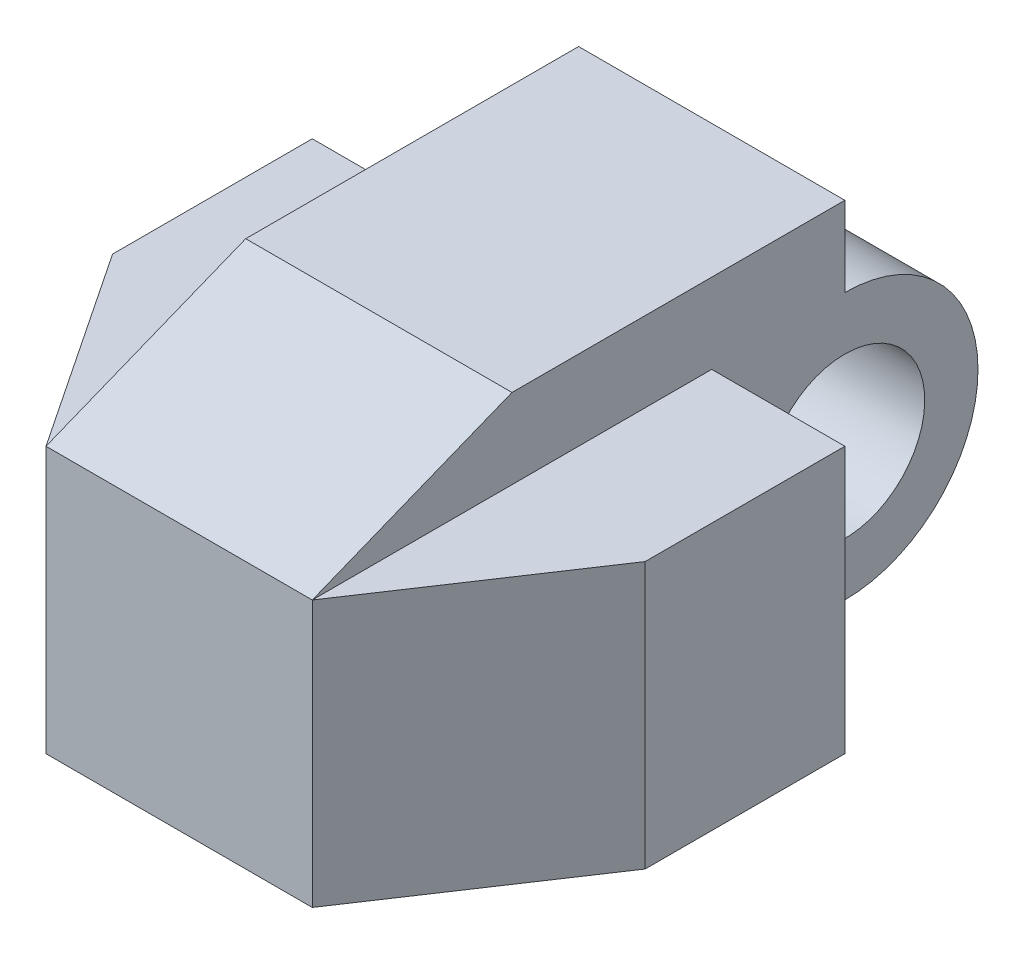
ISO-10303-21;
HEADER;
FILE_DESCRIPTION(('STEP AP214'),'2;1');
FILE_NAME('part.step','',(''),(''),'','','');
FILE_SCHEMA(('AUTOMOTIVE_DESIGN { 1 0 10303 214 1 1 1 1 }'));
ENDSEC;
DATA;
#1=APPLICATION_CONTEXT('core data for automotive mechanical design processes');
#2=APPLICATION_PROTOCOL_DEFINITION('international standard','automotive_design',2000,#1);
#3=PRODUCT_CONTEXT('',#1,'mechanical');
#4=PRODUCT('Part','Part','',(#3));
#5=PRODUCT_RELATED_PRODUCT_CATEGORY('part','',(#4));
#6=PRODUCT_DEFINITION_FORMATION('','',#4);
#7=PRODUCT_DEFINITION_CONTEXT('part definition',#1,'design');
#8=PRODUCT_DEFINITION('design','',#6,#7);
#9=PRODUCT_DEFINITION_SHAPE('','',#8);
#10=(LENGTH_UNIT() NAMED_UNIT(*) SI_UNIT(.MILLI.,.METRE.));
#11=(NAMED_UNIT(*) PLANE_ANGLE_UNIT() SI_UNIT($,.RADIAN.));
#12=(NAMED_UNIT(*) SI_UNIT($,.STERADIAN.) SOLID_ANGLE_UNIT());
#13=UNCERTAINTY_MEASURE_WITH_UNIT(LENGTH_MEASURE(1.E-05),#10,'distance_accuracy_value','');
#14=(GEOMETRIC_REPRESENTATION_CONTEXT(3) GLOBAL_UNCERTAINTY_ASSIGNED_CONTEXT((#13)) GLOBAL_UNIT_ASSIGNED_CONTEXT((#10,
#11,#12)) REPRESENTATION_CONTEXT('',''));
#15=CARTESIAN_POINT('',(0.,0.,0.));
#16=DIRECTION('',(0.,0.,1.));
#17=DIRECTION('',(1.,0.,0.));
#18=AXIS2_PLACEMENT_3D('',#15,#16,#17);
#19=CARTESIAN_POINT('',(-3.67875647668393,4.89637305699482,10.));
#20=DIRECTION('',(0.,-1.,0.));
#21=DIRECTION('',(0.,0.,-1.));
#22=AXIS2_PLACEMENT_3D('',#19,#20,#21);
#23=PLANE('',#22);
#24=DIRECTION('',(0.,0.,1.));
#25=VECTOR('',#24,1.);
#26=CARTESIAN_POINT('',(-3.67875647668393,4.89637305699482,5.));
#27=LINE('',#26,#25);
#28=CARTESIAN_POINT('',(-3.67875647668393,4.89637305699482,10.));
#29=VERTEX_POINT('',#28);
#30=CARTESIAN_POINT('',(-3.67875647668393,4.89637305699482,25.));
#31=VERTEX_POINT('',#30);
#32=EDGE_CURVE('E137',#29,#31,#27,.T.);
#33=ORIENTED_EDGE('',*,*,#32,.F.);
#34=DIRECTION('',(-1.,0.,0.));
#35=VECTOR('',#34,1.);
#36=CARTESIAN_POINT('',(-8.67875647668393,4.89637305699482,10.));
#37=LINE('',#36,#35);
#38=CARTESIAN_POINT('',(-8.67875647668393,4.89637305699482,10.));
#39=VERTEX_POINT('',#38);
#40=EDGE_CURVE('E216',#29,#39,#37,.T.);
#41=ORIENTED_EDGE('',*,*,#40,.T.);
#42=DIRECTION('',(0.,0.,-1.));
#43=VECTOR('',#42,1.);
#44=CARTESIAN_POINT('',(-8.67875647668393,4.89637305699482,25.));
#45=LINE('',#44,#43);
#46=CARTESIAN_POINT('',(-8.67875647668393,4.89637305699482,17.5));
#47=VERTEX_POINT('',#46);
#48=EDGE_CURVE('E213',#47,#39,#45,.T.);
#49=ORIENTED_EDGE('',*,*,#48,.F.);
#50=DIRECTION('',(-0.554700196225229,0.,-0.832050294337844));
#51=VECTOR('',#50,1.);
#52=CARTESIAN_POINT('',(-14.0852929453966,4.89637305699482,9.39019529693105));
#53=LINE('',#52,#51);
#54=EDGE_CURVE('E232',#31,#47,#53,.T.);
#55=ORIENTED_EDGE('',*,*,#54,.F.);
#56=EDGE_LOOP('',(#33,#41,#49,#55));
#57=FACE_BOUND('',#56,.T.);
#58=ADVANCED_FACE('F38',(#57),#23,.F.);
#59=DIRECTION('',(0.,0.,-1.));
#60=VECTOR('',#59,1.);
#61=CARTESIAN_POINT('',(6.32124352331607,4.89637305699482,5.));
#62=LINE('',#61,#60);
#63=CARTESIAN_POINT('',(6.32124352331607,4.89637305699482,25.));
#64=VERTEX_POINT('',#63);
#65=CARTESIAN_POINT('',(6.32124352331607,4.89637305699482,10.));
#66=VERTEX_POINT('',#65);
#67=EDGE_CURVE('E146',#64,#66,#62,.T.);
#68=ORIENTED_EDGE('',*,*,#67,.F.);
#69=DIRECTION('',(0.554700196225229,0.,-0.832050294337844));
#70=VECTOR('',#69,1.);
#71=CARTESIAN_POINT('',(15.9147070546034,4.89637305699482,10.609804703069));
#72=LINE('',#71,#70);
#73=CARTESIAN_POINT('',(11.3212435233161,4.89637305699482,17.5));
#74=VERTEX_POINT('',#73);
#75=EDGE_CURVE('E155',#64,#74,#72,.T.);
#76=ORIENTED_EDGE('',*,*,#75,.T.);
#77=DIRECTION('',(0.,0.,-1.));
#78=VECTOR('',#77,1.);
#79=CARTESIAN_POINT('',(11.3212435233161,4.89637305699482,25.));
#80=LINE('',#79,#78);
#81=CARTESIAN_POINT('',(11.3212435233161,4.89637305699482,10.));
#82=VERTEX_POINT('',#81);
#83=EDGE_CURVE('E211',#74,#82,#80,.T.);
#84=ORIENTED_EDGE('',*,*,#83,.T.);
#85=EDGE_CURVE('E158',#82,#66,#37,.T.);
#86=ORIENTED_EDGE('',*,*,#85,.T.);
#87=EDGE_LOOP('',(#68,#76,#84,#86));
#88=FACE_BOUND('',#87,.T.);
#89=ADVANCED_FACE('F154',(#88),#23,.F.);
#90=CARTESIAN_POINT('',(-3.67875647668393,-5.10362694300518,10.));
#91=DIRECTION('',(0.,1.,0.));
#92=DIRECTION('',(0.,0.,1.));
#93=AXIS2_PLACEMENT_3D('',#90,#91,#92);
#94=PLANE('',#93);
#95=DIRECTION('',(1.,0.,0.));
#96=VECTOR('',#95,1.);
#97=CARTESIAN_POINT('',(-8.67875647668393,-5.10362694300518,25.));
#98=LINE('',#97,#96);
#99=CARTESIAN_POINT('',(-3.67875647668393,-5.10362694300518,25.));
#100=VERTEX_POINT('',#99);
#101=CARTESIAN_POINT('',(6.32124352331607,-5.10362694300518,25.));
#102=VERTEX_POINT('',#101);
#103=EDGE_CURVE('E171',#100,#102,#98,.T.);
#104=ORIENTED_EDGE('',*,*,#103,.F.);
#105=DIRECTION('',(-0.554700196225229,0.,-0.832050294337844));
#106=VECTOR('',#105,1.);
#107=CARTESIAN_POINT('',(-10.6018333997609,-5.10362694300518,14.6153846153846));
#108=LINE('',#107,#106);
#109=CARTESIAN_POINT('',(-8.67875647668393,-5.10362694300518,17.5));
#110=VERTEX_POINT('',#109);
#111=EDGE_CURVE('E60',#100,#110,#108,.T.);
#112=ORIENTED_EDGE('',*,*,#111,.T.);
#113=DIRECTION('',(0.,0.,-1.));
#114=VECTOR('',#113,1.);
#115=CARTESIAN_POINT('',(-8.67875647668393,-5.10362694300518,25.));
#116=LINE('',#115,#114);
#117=CARTESIAN_POINT('',(-8.67875647668393,-5.10362694300518,10.));
#118=VERTEX_POINT('',#117);
#119=EDGE_CURVE('E180',#110,#118,#116,.T.);
#120=ORIENTED_EDGE('',*,*,#119,.T.);
#121=DIRECTION('',(1.,0.,0.));
#122=VECTOR('',#121,1.);
#123=CARTESIAN_POINT('',(-8.67875647668393,-5.10362694300518,10.));
#124=LINE('',#123,#122);
#125=CARTESIAN_POINT('',(-3.67875647668393,-5.10362694300518,10.));
#126=VERTEX_POINT('',#125);
#127=EDGE_CURVE('E220',#118,#126,#124,.T.);
#128=ORIENTED_EDGE('',*,*,#127,.T.);
#129=DIRECTION('',(0.,0.,-1.));
#130=VECTOR('',#129,1.);
#131=CARTESIAN_POINT('',(-3.67875647668393,-5.10362694300518,10.));
#132=LINE('',#131,#130);
#133=CARTESIAN_POINT('',(-3.67875647668393,-5.10362694300518,5.));
#134=VERTEX_POINT('',#133);
#135=EDGE_CURVE('E192',#126,#134,#132,.T.);
#136=ORIENTED_EDGE('',*,*,#135,.T.);
#137=DIRECTION('',(1.,0.,0.));
#138=VECTOR('',#137,1.);
#139=CARTESIAN_POINT('',(-3.67875647668393,-5.10362694300518,5.));
#140=LINE('',#139,#138);
#141=CARTESIAN_POINT('',(6.32124352331607,-5.10362694300518,5.));
#142=VERTEX_POINT('',#141);
#143=EDGE_CURVE('E189',#134,#142,#140,.T.);
#144=ORIENTED_EDGE('',*,*,#143,.T.);
#145=DIRECTION('',(0.,0.,-1.));
#146=VECTOR('',#145,1.);
#147=CARTESIAN_POINT('',(6.32124352331607,-5.10362694300518,10.));
#148=LINE('',#147,#146);
#149=CARTESIAN_POINT('',(6.32124352331607,-5.10362694300518,10.));
#150=VERTEX_POINT('',#149);
#151=EDGE_CURVE('E195',#150,#142,#148,.T.);
#152=ORIENTED_EDGE('',*,*,#151,.F.);
#153=CARTESIAN_POINT('',(11.3212435233161,-5.10362694300518,10.));
#154=VERTEX_POINT('',#153);
#155=EDGE_CURVE('E223',#150,#154,#124,.T.);
#156=ORIENTED_EDGE('',*,*,#155,.T.);
#157=DIRECTION('',(0.,0.,-1.));
#158=VECTOR('',#157,1.);
#159=CARTESIAN_POINT('',(11.3212435233161,-5.10362694300518,25.));
#160=LINE('',#159,#158);
#161=CARTESIAN_POINT('',(11.3212435233161,-5.10362694300518,17.5));
#162=VERTEX_POINT('',#161);
#163=EDGE_CURVE('E209',#162,#154,#160,.T.);
#164=ORIENTED_EDGE('',*,*,#163,.F.);
#165=DIRECTION('',(0.554700196225229,0.,-0.832050294337844));
#166=VECTOR('',#165,1.);
#167=CARTESIAN_POINT('',(10.1673973694699,-5.10362694300518,19.2307692307692));
#168=LINE('',#167,#166);
#169=EDGE_CURVE('E229',#102,#162,#168,.T.);
#170=ORIENTED_EDGE('',*,*,#169,.F.);
#171=EDGE_LOOP('',(#104,#112,#120,#128,#136,#144,#152,#156,#164,#170));
#172=FACE_BOUND('',#171,.T.);
#173=ADVANCED_FACE('F269',(#172),#94,.F.);
#174=CARTESIAN_POINT('',(11.3212435233161,4.89637305699482,25.));
#175=DIRECTION('',(-1.,0.,0.));
#176=DIRECTION('',(0.,0.,1.));
#177=AXIS2_PLACEMENT_3D('',#174,#175,#176);
#178=PLANE('',#177);
#179=DIRECTION('',(0.,1.,0.));
#180=VECTOR('',#179,1.);
#181=CARTESIAN_POINT('',(11.3212435233161,-10.1036269430052,17.5));
#182=LINE('',#181,#180);
#183=EDGE_CURVE('E165',#162,#74,#182,.T.);
#184=ORIENTED_EDGE('',*,*,#183,.F.);
#185=ORIENTED_EDGE('',*,*,#163,.T.);
#186=DIRECTION('',(0.,1.,0.));
#187=VECTOR('',#186,1.);
#188=CARTESIAN_POINT('',(11.3212435233161,4.89637305699482,10.));
#189=LINE('',#188,#187);
#190=EDGE_CURVE('E217',#154,#82,#189,.T.);
#191=ORIENTED_EDGE('',*,*,#190,.T.);
#192=ORIENTED_EDGE('',*,*,#83,.F.);
#193=EDGE_LOOP('',(#184,#185,#191,#192));
#194=FACE_BOUND('',#193,.T.);
#195=ADVANCED_FACE('F277',(#194),#178,.F.);
#196=CARTESIAN_POINT('',(0.,0.,25.));
#197=DIRECTION('',(0.,0.,1.));
#198=DIRECTION('',(1.,0.,0.));
#199=AXIS2_PLACEMENT_3D('',#196,#197,#198);
#200=PLANE('',#199);
#201=DIRECTION('',(-1.,0.,0.));
#202=VECTOR('',#201,1.);
#203=CARTESIAN_POINT('',(6.32124352331607,4.89637305699482,25.));
#204=LINE('',#203,#202);
#205=EDGE_CURVE('E131',#64,#31,#204,.T.);
#206=ORIENTED_EDGE('',*,*,#205,.T.);
#207=DIRECTION('',(0.,1.,0.));
#208=VECTOR('',#207,1.);
#209=CARTESIAN_POINT('',(-3.67875647668393,0.,25.));
#210=LINE('',#209,#208);
#211=EDGE_CURVE('E11',#100,#31,#210,.T.);
#212=ORIENTED_EDGE('',*,*,#211,.F.);
#213=ORIENTED_EDGE('',*,*,#103,.T.);
#214=DIRECTION('',(0.,1.,0.));
#215=VECTOR('',#214,1.);
#216=CARTESIAN_POINT('',(6.32124352331608,0.,25.));
#217=LINE('',#216,#215);
#218=EDGE_CURVE('E46',#102,#64,#217,.T.);
#219=ORIENTED_EDGE('',*,*,#218,.T.);
#220=EDGE_LOOP('',(#206,#212,#213,#219));
#221=FACE_BOUND('',#220,.T.);
#222=ADVANCED_FACE('F169',(#221),#200,.T.);
#223=CARTESIAN_POINT('',(-3.67875647668393,4.89637305699482,10.));
#224=DIRECTION('',(1.,0.,0.));
#225=DIRECTION('',(0.,0.,-1.));
#226=AXIS2_PLACEMENT_3D('',#223,#224,#225);
#227=PLANE('',#226);
#228=CARTESIAN_POINT('',(-3.67875647668393,-0.103626943005185,5.));
#229=DIRECTION('',(1.,0.,0.));
#230=DIRECTION('',(0.,1.,0.));
#231=AXIS2_PLACEMENT_3D('',#228,#229,#230);
#232=CIRCLE('',#231,3.);
#233=CARTESIAN_POINT('',(-3.67875647668393,2.89637305699482,5.));
#234=VERTEX_POINT('',#233);
#235=EDGE_CURVE('E203',#234,#234,#232,.T.);
#236=ORIENTED_EDGE('',*,*,#235,.T.);
#237=EDGE_LOOP('',(#236));
#238=FACE_BOUND('',#237,.T.);
#239=ORIENTED_EDGE('',*,*,#32,.T.);
#240=DIRECTION('',(0.,-0.371390676354104,0.928476690885259));
#241=VECTOR('',#240,1.);
#242=CARTESIAN_POINT('',(-3.67875647668393,7.89637305699482,17.5));
#243=LINE('',#242,#241);
#244=CARTESIAN_POINT('',(-3.67875647668393,7.89637305699482,17.5));
#245=VERTEX_POINT('',#244);
#246=EDGE_CURVE('E134',#245,#31,#243,.T.);
#247=ORIENTED_EDGE('',*,*,#246,.F.);
#248=DIRECTION('',(0.,0.,1.));
#249=VECTOR('',#248,1.);
#250=CARTESIAN_POINT('',(-3.67875647668393,7.89637305699482,5.));
#251=LINE('',#250,#249);
#252=CARTESIAN_POINT('',(-3.67875647668393,7.89637305699482,5.));
#253=VERTEX_POINT('',#252);
#254=EDGE_CURVE('E159',#253,#245,#251,.T.);
#255=ORIENTED_EDGE('',*,*,#254,.F.);
#256=DIRECTION('',(0.,-1.,0.));
#257=VECTOR('',#256,1.);
#258=CARTESIAN_POINT('',(-3.67875647668393,7.89637305699482,5.));
#259=LINE('',#258,#257);
#260=CARTESIAN_POINT('',(-3.67875647668393,4.89637305699482,5.));
#261=VERTEX_POINT('',#260);
#262=EDGE_CURVE('E239',#253,#261,#259,.T.);
#263=ORIENTED_EDGE('',*,*,#262,.T.);
#264=CARTESIAN_POINT('',(-3.67875647668393,-0.103626943005183,5.));
#265=DIRECTION('',(1.,0.,0.));
#266=DIRECTION('',(0.,0.,-1.));
#267=AXIS2_PLACEMENT_3D('',#264,#265,#266);
#268=CIRCLE('',#267,5.);
#269=CARTESIAN_POINT('',(-3.67875647668393,-0.103626943005183,0.));
#270=VERTEX_POINT('',#269);
#271=EDGE_CURVE('E183',#261,#270,#268,.F.);
#272=ORIENTED_EDGE('',*,*,#271,.T.);
#273=CARTESIAN_POINT('',(-3.67875647668393,-0.103626943005183,5.));
#274=DIRECTION('',(1.,0.,0.));
#275=DIRECTION('',(0.,0.,-1.));
#276=AXIS2_PLACEMENT_3D('',#273,#274,#275);
#277=CIRCLE('',#276,5.);
#278=EDGE_CURVE('E174',#270,#134,#277,.F.);
#279=ORIENTED_EDGE('',*,*,#278,.T.);
#280=ORIENTED_EDGE('',*,*,#135,.F.);
#281=DIRECTION('',(0.,-1.,0.));
#282=VECTOR('',#281,1.);
#283=CARTESIAN_POINT('',(-3.67875647668393,4.89637305699482,10.));
#284=LINE('',#283,#282);
#285=EDGE_CURVE('E200',#29,#126,#284,.T.);
#286=ORIENTED_EDGE('',*,*,#285,.F.);
#287=EDGE_LOOP('',(#239,#247,#255,#263,#272,#279,#280,#286));
#288=FACE_BOUND('',#287,.T.);
#289=ADVANCED_FACE('F253',(#238,#288),#227,.F.);
#290=CARTESIAN_POINT('',(6.32124352331607,4.89637305699482,10.));
#291=DIRECTION('',(-1.,0.,0.));
#292=DIRECTION('',(0.,-1.,0.));
#293=AXIS2_PLACEMENT_3D('',#290,#291,#292);
#294=PLANE('',#293);
#295=CARTESIAN_POINT('',(6.32124352331607,-0.103626943005183,5.));
#296=DIRECTION('',(1.,0.,0.));
#297=DIRECTION('',(0.,1.,0.));
#298=AXIS2_PLACEMENT_3D('',#295,#296,#297);
#299=CIRCLE('',#298,3.);
#300=CARTESIAN_POINT('',(6.32124352331607,2.89637305699482,5.));
#301=VERTEX_POINT('',#300);
#302=EDGE_CURVE('E179',#301,#301,#299,.T.);
#303=ORIENTED_EDGE('',*,*,#302,.F.);
#304=EDGE_LOOP('',(#303));
#305=FACE_BOUND('',#304,.T.);
#306=DIRECTION('',(0.,0.,-1.));
#307=VECTOR('',#306,1.);
#308=CARTESIAN_POINT('',(6.32124352331607,7.89637305699482,5.));
#309=LINE('',#308,#307);
#310=CARTESIAN_POINT('',(6.32124352331607,7.89637305699482,17.5));
#311=VERTEX_POINT('',#310);
#312=CARTESIAN_POINT('',(6.32124352331607,7.89637305699482,5.));
#313=VERTEX_POINT('',#312);
#314=EDGE_CURVE('E148',#311,#313,#309,.T.);
#315=ORIENTED_EDGE('',*,*,#314,.F.);
#316=DIRECTION('',(0.,-0.371390676354104,0.928476690885259));
#317=VECTOR('',#316,1.);
#318=CARTESIAN_POINT('',(6.32124352331607,7.89637305699482,17.5));
#319=LINE('',#318,#317);
#320=EDGE_CURVE('E53',#311,#64,#319,.T.);
#321=ORIENTED_EDGE('',*,*,#320,.T.);
#322=ORIENTED_EDGE('',*,*,#67,.T.);
#323=DIRECTION('',(0.,1.,0.));
#324=VECTOR('',#323,1.);
#325=CARTESIAN_POINT('',(6.32124352331607,4.89637305699482,10.));
#326=LINE('',#325,#324);
#327=EDGE_CURVE('E198',#150,#66,#326,.T.);
#328=ORIENTED_EDGE('',*,*,#327,.F.);
#329=ORIENTED_EDGE('',*,*,#151,.T.);
#330=CARTESIAN_POINT('',(6.32124352331607,-0.103626943005183,5.));
#331=DIRECTION('',(-1.,0.,0.));
#332=DIRECTION('',(0.,-1.,0.));
#333=AXIS2_PLACEMENT_3D('',#330,#331,#332);
#334=CIRCLE('',#333,5.);
#335=CARTESIAN_POINT('',(6.32124352331607,-0.103626943005183,0.));
#336=VERTEX_POINT('',#335);
#337=EDGE_CURVE('E185',#142,#336,#334,.F.);
#338=ORIENTED_EDGE('',*,*,#337,.T.);
#339=CARTESIAN_POINT('',(6.32124352331607,-0.103626943005183,5.));
#340=DIRECTION('',(-1.,0.,0.));
#341=DIRECTION('',(0.,-1.,0.));
#342=AXIS2_PLACEMENT_3D('',#339,#340,#341);
#343=CIRCLE('',#342,5.);
#344=CARTESIAN_POINT('',(6.32124352331607,4.89637305699482,5.));
#345=VERTEX_POINT('',#344);
#346=EDGE_CURVE('E187',#336,#345,#343,.F.);
#347=ORIENTED_EDGE('',*,*,#346,.T.);
#348=DIRECTION('',(0.,-1.,0.));
#349=VECTOR('',#348,1.);
#350=CARTESIAN_POINT('',(6.32124352331607,7.89637305699482,5.));
#351=LINE('',#350,#349);
#352=EDGE_CURVE('E166',#313,#345,#351,.T.);
#353=ORIENTED_EDGE('',*,*,#352,.F.);
#354=EDGE_LOOP('',(#315,#321,#322,#328,#329,#338,#347,#353));
#355=FACE_BOUND('',#354,.T.);
#356=ADVANCED_FACE('F144',(#305,#355),#294,.F.);
#357=CARTESIAN_POINT('',(-3.67875647668393,-0.103626943005185,5.));
#358=DIRECTION('',(1.,0.,0.));
#359=DIRECTION('',(0.,1.,0.));
#360=AXIS2_PLACEMENT_3D('',#357,#358,#359);
#361=CYLINDRICAL_SURFACE('',#360,3.);
#362=ORIENTED_EDGE('',*,*,#235,.F.);
#363=EDGE_LOOP('',(#362));
#364=FACE_BOUND('',#363,.T.);
#365=ORIENTED_EDGE('',*,*,#302,.T.);
#366=EDGE_LOOP('',(#365));
#367=FACE_BOUND('',#366,.T.);
#368=ADVANCED_FACE('F296',(#364,#367),#361,.F.);
#369=CARTESIAN_POINT('',(-3.67875647668393,-0.103626943005183,5.));
#370=DIRECTION('',(-1.,0.,0.));
#371=DIRECTION('',(0.,0.,1.));
#372=AXIS2_PLACEMENT_3D('',#369,#370,#371);
#373=CYLINDRICAL_SURFACE('',#372,5.);
#374=DIRECTION('',(-1.,0.,0.));
#375=VECTOR('',#374,1.);
#376=CARTESIAN_POINT('',(0.,-0.103626943005183,0.));
#377=LINE('',#376,#375);
#378=EDGE_CURVE('E177',#270,#336,#377,.F.);
#379=ORIENTED_EDGE('',*,*,#378,.F.);
#380=ORIENTED_EDGE('',*,*,#271,.F.);
#381=DIRECTION('',(-1.,0.,0.));
#382=VECTOR('',#381,1.);
#383=CARTESIAN_POINT('',(-3.67875647668393,4.89637305699482,5.));
#384=LINE('',#383,#382);
#385=EDGE_CURVE('E172',#345,#261,#384,.T.);
#386=ORIENTED_EDGE('',*,*,#385,.F.);
#387=ORIENTED_EDGE('',*,*,#346,.F.);
#388=EDGE_LOOP('',(#379,#380,#386,#387));
#389=FACE_BOUND('',#388,.T.);
#390=ADVANCED_FACE('F40',(#389),#373,.T.);
#391=CARTESIAN_POINT('',(-3.67875647668393,-0.103626943005183,5.));
#392=DIRECTION('',(1.,0.,0.));
#393=DIRECTION('',(0.,0.,-1.));
#394=AXIS2_PLACEMENT_3D('',#391,#392,#393);
#395=CYLINDRICAL_SURFACE('',#394,5.);
#396=ORIENTED_EDGE('',*,*,#278,.F.);
#397=ORIENTED_EDGE('',*,*,#378,.T.);
#398=ORIENTED_EDGE('',*,*,#337,.F.);
#399=ORIENTED_EDGE('',*,*,#143,.F.);
#400=EDGE_LOOP('',(#396,#397,#398,#399));
#401=FACE_BOUND('',#400,.T.);
#402=ADVANCED_FACE('F267',(#401),#395,.T.);
#403=CARTESIAN_POINT('',(0.,0.,10.));
#404=DIRECTION('',(0.,0.,1.));
#405=DIRECTION('',(1.,0.,0.));
#406=AXIS2_PLACEMENT_3D('',#403,#404,#405);
#407=PLANE('',#406);
#408=ORIENTED_EDGE('',*,*,#40,.F.);
#409=ORIENTED_EDGE('',*,*,#285,.T.);
#410=ORIENTED_EDGE('',*,*,#127,.F.);
#411=DIRECTION('',(0.,-1.,0.));
#412=VECTOR('',#411,1.);
#413=CARTESIAN_POINT('',(-8.67875647668393,4.89637305699482,10.));
#414=LINE('',#413,#412);
#415=EDGE_CURVE('E224',#39,#118,#414,.T.);
#416=ORIENTED_EDGE('',*,*,#415,.F.);
#417=EDGE_LOOP('',(#408,#409,#410,#416));
#418=FACE_BOUND('',#417,.T.);
#419=ADVANCED_FACE('F303',(#418),#407,.F.);
#420=ORIENTED_EDGE('',*,*,#155,.F.);
#421=ORIENTED_EDGE('',*,*,#327,.T.);
#422=ORIENTED_EDGE('',*,*,#85,.F.);
#423=ORIENTED_EDGE('',*,*,#190,.F.);
#424=EDGE_LOOP('',(#420,#421,#422,#423));
#425=FACE_BOUND('',#424,.T.);
#426=ADVANCED_FACE('F274',(#425),#407,.F.);
#427=CARTESIAN_POINT('',(-8.67875647668393,4.89637305699482,25.));
#428=DIRECTION('',(1.,0.,0.));
#429=DIRECTION('',(0.,1.,0.));
#430=AXIS2_PLACEMENT_3D('',#427,#428,#429);
#431=PLANE('',#430);
#432=ORIENTED_EDGE('',*,*,#119,.F.);
#433=DIRECTION('',(0.,1.,0.));
#434=VECTOR('',#433,1.);
#435=CARTESIAN_POINT('',(-8.67875647668393,-10.1036269430052,17.5));
#436=LINE('',#435,#434);
#437=EDGE_CURVE('E231',#110,#47,#436,.T.);
#438=ORIENTED_EDGE('',*,*,#437,.T.);
#439=ORIENTED_EDGE('',*,*,#48,.T.);
#440=ORIENTED_EDGE('',*,*,#415,.T.);
#441=EDGE_LOOP('',(#432,#438,#439,#440));
#442=FACE_BOUND('',#441,.T.);
#443=ADVANCED_FACE('F391',(#442),#431,.F.);
#444=CARTESIAN_POINT('',(15.9147070546034,-10.1036269430052,10.609804703069));
#445=DIRECTION('',(0.832050294337844,0.,0.554700196225229));
#446=DIRECTION('',(0.554700196225229,0.,-0.832050294337844));
#447=AXIS2_PLACEMENT_3D('',#444,#445,#446);
#448=PLANE('',#447);
#449=ORIENTED_EDGE('',*,*,#169,.T.);
#450=ORIENTED_EDGE('',*,*,#183,.T.);
#451=ORIENTED_EDGE('',*,*,#75,.F.);
#452=ORIENTED_EDGE('',*,*,#218,.F.);
#453=EDGE_LOOP('',(#449,#450,#451,#452));
#454=FACE_BOUND('',#453,.T.);
#455=ADVANCED_FACE('F162',(#454),#448,.T.);
#456=CARTESIAN_POINT('',(-14.0852929453966,-10.1036269430052,9.39019529693105));
#457=DIRECTION('',(0.832050294337844,0.,-0.554700196225229));
#458=DIRECTION('',(-0.554700196225229,0.,-0.832050294337844));
#459=AXIS2_PLACEMENT_3D('',#456,#457,#458);
#460=PLANE('',#459);
#461=ORIENTED_EDGE('',*,*,#211,.T.);
#462=ORIENTED_EDGE('',*,*,#54,.T.);
#463=ORIENTED_EDGE('',*,*,#437,.F.);
#464=ORIENTED_EDGE('',*,*,#111,.F.);
#465=EDGE_LOOP('',(#461,#462,#463,#464));
#466=FACE_BOUND('',#465,.T.);
#467=ADVANCED_FACE('F359',(#466),#460,.F.);
#468=CARTESIAN_POINT('',(-3.67875647668393,7.89637305699482,5.));
#469=DIRECTION('',(0.,0.,1.));
#470=DIRECTION('',(1.,0.,0.));
#471=AXIS2_PLACEMENT_3D('',#468,#469,#470);
#472=PLANE('',#471);
#473=ORIENTED_EDGE('',*,*,#385,.T.);
#474=ORIENTED_EDGE('',*,*,#262,.F.);
#475=DIRECTION('',(-1.,0.,0.));
#476=VECTOR('',#475,1.);
#477=CARTESIAN_POINT('',(-3.67875647668393,7.89637305699482,5.));
#478=LINE('',#477,#476);
#479=EDGE_CURVE('E241',#313,#253,#478,.T.);
#480=ORIENTED_EDGE('',*,*,#479,.F.);
#481=ORIENTED_EDGE('',*,*,#352,.T.);
#482=EDGE_LOOP('',(#473,#474,#480,#481));
#483=FACE_BOUND('',#482,.T.);
#484=ADVANCED_FACE('F259',(#483),#472,.F.);
#485=CARTESIAN_POINT('',(0.,7.89637305699482,0.));
#486=DIRECTION('',(0.,1.,0.));
#487=DIRECTION('',(0.,0.,1.));
#488=AXIS2_PLACEMENT_3D('',#485,#486,#487);
#489=PLANE('',#488);
#490=DIRECTION('',(-1.,0.,0.));
#491=VECTOR('',#490,1.);
#492=CARTESIAN_POINT('',(6.32124352331607,7.89637305699482,17.5));
#493=LINE('',#492,#491);
#494=EDGE_CURVE('E138',#311,#245,#493,.T.);
#495=ORIENTED_EDGE('',*,*,#494,.F.);
#496=ORIENTED_EDGE('',*,*,#314,.T.);
#497=ORIENTED_EDGE('',*,*,#479,.T.);
#498=ORIENTED_EDGE('',*,*,#254,.T.);
#499=EDGE_LOOP('',(#495,#496,#497,#498));
#500=FACE_BOUND('',#499,.T.);
#501=ADVANCED_FACE('F255',(#500),#489,.T.);
#502=CARTESIAN_POINT('',(6.32124352331607,7.89637305699482,17.5));
#503=DIRECTION('',(0.,-0.928476690885259,-0.371390676354104));
#504=DIRECTION('',(0.,0.371390676354104,-0.928476690885259));
#505=AXIS2_PLACEMENT_3D('',#502,#503,#504);
#506=PLANE('',#505);
#507=ORIENTED_EDGE('',*,*,#246,.T.);
#508=ORIENTED_EDGE('',*,*,#205,.F.);
#509=ORIENTED_EDGE('',*,*,#320,.F.);
#510=ORIENTED_EDGE('',*,*,#494,.T.);
#511=EDGE_LOOP('',(#507,#508,#509,#510));
#512=FACE_BOUND('',#511,.T.);
#513=ADVANCED_FACE('F132',(#512),#506,.F.);
#514=CLOSED_SHELL('',(#58,#89,#173,#195,#222,#289,#356,#368,#390,#402,#419,#426,#443,#455,#467,
#484,#501,#513));
#515=MANIFOLD_SOLID_BREP('B2',#514);
#516=ADVANCED_BREP_SHAPE_REPRESENTATION('',(#18,#515),#14);
#517=SHAPE_DEFINITION_REPRESENTATION(#9,#516);
ENDSEC;
END-ISO-10303-21;
